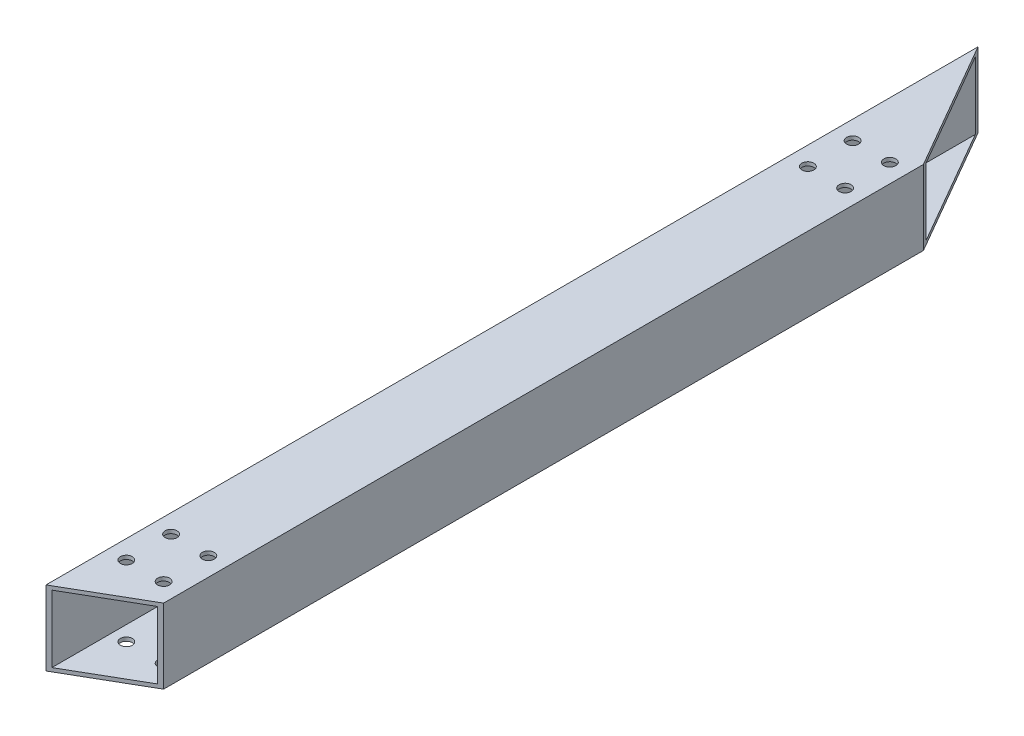
ISO-10303-21;
HEADER;
FILE_DESCRIPTION(('STEP AP214'),'2;1');
FILE_NAME('part.step','',(''),(''),'','','');
FILE_SCHEMA(('AUTOMOTIVE_DESIGN { 1 0 10303 214 1 1 1 1 }'));
ENDSEC;
DATA;
#1=APPLICATION_CONTEXT('core data for automotive mechanical design processes');
#2=APPLICATION_PROTOCOL_DEFINITION('international standard','automotive_design',2000,#1);
#3=PRODUCT_CONTEXT('',#1,'mechanical');
#4=PRODUCT('Part','Part','',(#3));
#5=PRODUCT_RELATED_PRODUCT_CATEGORY('part','',(#4));
#6=PRODUCT_DEFINITION_FORMATION('','',#4);
#7=PRODUCT_DEFINITION_CONTEXT('part definition',#1,'design');
#8=PRODUCT_DEFINITION('design','',#6,#7);
#9=PRODUCT_DEFINITION_SHAPE('','',#8);
#10=(LENGTH_UNIT() NAMED_UNIT(*) SI_UNIT(.MILLI.,.METRE.));
#11=(NAMED_UNIT(*) PLANE_ANGLE_UNIT() SI_UNIT($,.RADIAN.));
#12=(NAMED_UNIT(*) SI_UNIT($,.STERADIAN.) SOLID_ANGLE_UNIT());
#13=UNCERTAINTY_MEASURE_WITH_UNIT(LENGTH_MEASURE(1.E-05),#10,'distance_accuracy_value','');
#14=(GEOMETRIC_REPRESENTATION_CONTEXT(3) GLOBAL_UNCERTAINTY_ASSIGNED_CONTEXT((#13)) GLOBAL_UNIT_ASSIGNED_CONTEXT((#10,
#11,#12)) REPRESENTATION_CONTEXT('',''));
#15=CARTESIAN_POINT('',(0.,0.,0.));
#16=DIRECTION('',(0.,0.,1.));
#17=DIRECTION('',(1.,0.,0.));
#18=AXIS2_PLACEMENT_3D('',#15,#16,#17);
#19=CARTESIAN_POINT('',(1.,19.,250.));
#20=DIRECTION('',(0.,-1.,0.));
#21=DIRECTION('',(0.,0.,-1.));
#22=AXIS2_PLACEMENT_3D('',#19,#20,#21);
#23=PLANE('',#22);
#24=CARTESIAN_POINT('',(15.0000000000003,19.,38.6410161513949));
#25=DIRECTION('',(0.,-1.,0.));
#26=DIRECTION('',(0.,0.,-1.));
#27=AXIS2_PLACEMENT_3D('',#24,#25,#26);
#28=CIRCLE('',#27,1.6);
#29=CARTESIAN_POINT('',(15.0000000000003,19.,37.0410161513949));
#30=VERTEX_POINT('',#29);
#31=EDGE_CURVE('E352',#30,#30,#28,.T.);
#32=ORIENTED_EDGE('',*,*,#31,.F.);
#33=EDGE_LOOP('',(#32));
#34=FACE_BOUND('',#33,.T.);
#35=CARTESIAN_POINT('',(5.00000000004269,19.,221.452994616241));
#36=DIRECTION('',(0.,-1.,0.));
#37=DIRECTION('',(0.,0.,-1.));
#38=AXIS2_PLACEMENT_3D('',#35,#36,#37);
#39=CIRCLE('',#38,1.6);
#40=CARTESIAN_POINT('',(5.00000000004269,19.,219.852994616241));
#41=VERTEX_POINT('',#40);
#42=EDGE_CURVE('E346',#41,#41,#39,.T.);
#43=ORIENTED_EDGE('',*,*,#42,.F.);
#44=EDGE_LOOP('',(#43));
#45=FACE_BOUND('',#44,.T.);
#46=CARTESIAN_POINT('',(15.0000000000427,19.,221.452994616241));
#47=DIRECTION('',(0.,-1.,0.));
#48=DIRECTION('',(0.,0.,-1.));
#49=AXIS2_PLACEMENT_3D('',#46,#47,#48);
#50=CIRCLE('',#49,1.59999999999998);
#51=CARTESIAN_POINT('',(15.0000000000427,19.,219.852994616241));
#52=VERTEX_POINT('',#51);
#53=EDGE_CURVE('E340',#52,#52,#50,.T.);
#54=ORIENTED_EDGE('',*,*,#53,.F.);
#55=EDGE_LOOP('',(#54));
#56=FACE_BOUND('',#55,.T.);
#57=CARTESIAN_POINT('',(15.0000000000429,19.,233.452994616241));
#58=DIRECTION('',(0.,-1.,0.));
#59=DIRECTION('',(0.,0.,-1.));
#60=AXIS2_PLACEMENT_3D('',#57,#58,#59);
#61=CIRCLE('',#60,1.59999999999999);
#62=CARTESIAN_POINT('',(15.0000000000429,19.,231.852994616241));
#63=VERTEX_POINT('',#62);
#64=EDGE_CURVE('E334',#63,#63,#61,.T.);
#65=ORIENTED_EDGE('',*,*,#64,.F.);
#66=EDGE_LOOP('',(#65));
#67=FACE_BOUND('',#66,.T.);
#68=CARTESIAN_POINT('',(5.00000000000034,19.,50.6410161513949));
#69=DIRECTION('',(0.,-1.,0.));
#70=DIRECTION('',(0.,0.,-1.));
#71=AXIS2_PLACEMENT_3D('',#68,#69,#70);
#72=CIRCLE('',#71,1.6);
#73=CARTESIAN_POINT('',(5.00000000000034,19.,49.0410161513949));
#74=VERTEX_POINT('',#73);
#75=EDGE_CURVE('E258',#74,#74,#72,.T.);
#76=ORIENTED_EDGE('',*,*,#75,.F.);
#77=EDGE_LOOP('',(#76));
#78=FACE_BOUND('',#77,.T.);
#79=CARTESIAN_POINT('',(15.0000000000003,19.,50.6410161513949));
#80=DIRECTION('',(0.,-1.,0.));
#81=DIRECTION('',(0.,0.,-1.));
#82=AXIS2_PLACEMENT_3D('',#79,#80,#81);
#83=CIRCLE('',#82,1.6);
#84=CARTESIAN_POINT('',(15.0000000000003,19.,49.0410161513949));
#85=VERTEX_POINT('',#84);
#86=EDGE_CURVE('E325',#85,#85,#83,.T.);
#87=ORIENTED_EDGE('',*,*,#86,.F.);
#88=EDGE_LOOP('',(#87));
#89=FACE_BOUND('',#88,.T.);
#90=CARTESIAN_POINT('',(5.00000000000031,19.,38.6410161513949));
#91=DIRECTION('',(0.,-1.,0.));
#92=DIRECTION('',(0.,0.,-1.));
#93=AXIS2_PLACEMENT_3D('',#90,#91,#92);
#94=CIRCLE('',#93,1.6);
#95=CARTESIAN_POINT('',(5.00000000000031,19.,37.0410161513949));
#96=VERTEX_POINT('',#95);
#97=EDGE_CURVE('E319',#96,#96,#94,.T.);
#98=ORIENTED_EDGE('',*,*,#97,.F.);
#99=EDGE_LOOP('',(#98));
#100=FACE_BOUND('',#99,.T.);
#101=CARTESIAN_POINT('',(5.00000000004288,19.,233.452994616241));
#102=DIRECTION('',(0.,-1.,0.));
#103=DIRECTION('',(0.,0.,-1.));
#104=AXIS2_PLACEMENT_3D('',#101,#102,#103);
#105=CIRCLE('',#104,1.6);
#106=CARTESIAN_POINT('',(5.00000000004288,19.,231.852994616241));
#107=VERTEX_POINT('',#106);
#108=EDGE_CURVE('E313',#107,#107,#105,.T.);
#109=ORIENTED_EDGE('',*,*,#108,.F.);
#110=EDGE_LOOP('',(#109));
#111=FACE_BOUND('',#110,.T.);
#112=DIRECTION('',(-0.500000000000004,0.,-0.866025403784436));
#113=VECTOR('',#112,1.);
#114=CARTESIAN_POINT('',(108.503175473055,19.,187.933012701891));
#115=LINE('',#114,#113);
#116=CARTESIAN_POINT('',(19.,19.,32.9089653438084));
#117=VERTEX_POINT('',#116);
#118=CARTESIAN_POINT('',(1.,19.,1.73205080756889));
#119=VERTEX_POINT('',#118);
#120=EDGE_CURVE('E11',#117,#119,#115,.T.);
#121=ORIENTED_EDGE('',*,*,#120,.F.);
#122=DIRECTION('',(0.,0.,-1.));
#123=VECTOR('',#122,1.);
#124=CARTESIAN_POINT('',(19.,19.,250.));
#125=LINE('',#124,#123);
#126=CARTESIAN_POINT('',(19.,19.,239.030344885397));
#127=VERTEX_POINT('',#126);
#128=EDGE_CURVE('E142',#127,#117,#125,.T.);
#129=ORIENTED_EDGE('',*,*,#128,.F.);
#130=DIRECTION('',(0.866025403784436,0.,-0.500000000000005));
#131=VECTOR('',#130,1.);
#132=CARTESIAN_POINT('',(0.749999999999995,19.,249.566987298108));
#133=LINE('',#132,#131);
#134=CARTESIAN_POINT('',(0.999999999999997,19.,249.42264973081));
#135=VERTEX_POINT('',#134);
#136=EDGE_CURVE('E43',#135,#127,#133,.T.);
#137=ORIENTED_EDGE('',*,*,#136,.F.);
#138=DIRECTION('',(0.,0.,-1.));
#139=VECTOR('',#138,1.);
#140=CARTESIAN_POINT('',(1.,19.,250.));
#141=LINE('',#140,#139);
#142=EDGE_CURVE('E148',#135,#119,#141,.T.);
#143=ORIENTED_EDGE('',*,*,#142,.T.);
#144=EDGE_LOOP('',(#121,#129,#137,#143));
#145=FACE_BOUND('',#144,.T.);
#146=ADVANCED_FACE('F35',(#34,#45,#56,#67,#78,#89,#100,#111,#145),#23,.T.);
#147=CARTESIAN_POINT('',(19.,1.,250.));
#148=DIRECTION('',(-1.,0.,0.));
#149=DIRECTION('',(0.,0.,1.));
#150=AXIS2_PLACEMENT_3D('',#147,#148,#149);
#151=PLANE('',#150);
#152=DIRECTION('',(0.,1.,0.));
#153=VECTOR('',#152,1.);
#154=CARTESIAN_POINT('',(19.,1.,32.9089653438083));
#155=LINE('',#154,#153);
#156=CARTESIAN_POINT('',(19.,1.,32.9089653438083));
#157=VERTEX_POINT('',#156);
#158=EDGE_CURVE('E165',#157,#117,#155,.T.);
#159=ORIENTED_EDGE('',*,*,#158,.F.);
#160=DIRECTION('',(0.,0.,-1.));
#161=VECTOR('',#160,1.);
#162=CARTESIAN_POINT('',(19.,1.,250.));
#163=LINE('',#162,#161);
#164=CARTESIAN_POINT('',(19.,1.,239.030344885397));
#165=VERTEX_POINT('',#164);
#166=EDGE_CURVE('E144',#165,#157,#163,.T.);
#167=ORIENTED_EDGE('',*,*,#166,.F.);
#168=DIRECTION('',(0.,-1.,0.));
#169=VECTOR('',#168,1.);
#170=CARTESIAN_POINT('',(19.,1.,239.030344885397));
#171=LINE('',#170,#169);
#172=EDGE_CURVE('E117',#127,#165,#171,.T.);
#173=ORIENTED_EDGE('',*,*,#172,.F.);
#174=ORIENTED_EDGE('',*,*,#128,.T.);
#175=EDGE_LOOP('',(#159,#167,#173,#174));
#176=FACE_BOUND('',#175,.T.);
#177=ADVANCED_FACE('F141',(#176),#151,.T.);
#178=CARTESIAN_POINT('',(1.,1.,250.));
#179=DIRECTION('',(0.,1.,0.));
#180=DIRECTION('',(0.,0.,1.));
#181=AXIS2_PLACEMENT_3D('',#178,#179,#180);
#182=PLANE('',#181);
#183=CARTESIAN_POINT('',(15.0000000000003,1.,38.6410161513949));
#184=DIRECTION('',(0.,1.,0.));
#185=DIRECTION('',(0.,0.,1.));
#186=AXIS2_PLACEMENT_3D('',#183,#184,#185);
#187=CIRCLE('',#186,1.6);
#188=CARTESIAN_POINT('',(15.0000000000003,1.,40.2410161513949));
#189=VERTEX_POINT('',#188);
#190=EDGE_CURVE('E349',#189,#189,#187,.T.);
#191=ORIENTED_EDGE('',*,*,#190,.F.);
#192=EDGE_LOOP('',(#191));
#193=FACE_BOUND('',#192,.T.);
#194=CARTESIAN_POINT('',(5.00000000004269,1.,221.452994616241));
#195=DIRECTION('',(0.,1.,0.));
#196=DIRECTION('',(0.,0.,1.));
#197=AXIS2_PLACEMENT_3D('',#194,#195,#196);
#198=CIRCLE('',#197,1.6);
#199=CARTESIAN_POINT('',(5.00000000004269,1.,223.052994616241));
#200=VERTEX_POINT('',#199);
#201=EDGE_CURVE('E343',#200,#200,#198,.T.);
#202=ORIENTED_EDGE('',*,*,#201,.F.);
#203=EDGE_LOOP('',(#202));
#204=FACE_BOUND('',#203,.T.);
#205=CARTESIAN_POINT('',(15.0000000000427,1.,221.452994616241));
#206=DIRECTION('',(0.,1.,0.));
#207=DIRECTION('',(0.,0.,1.));
#208=AXIS2_PLACEMENT_3D('',#205,#206,#207);
#209=CIRCLE('',#208,1.59999999999998);
#210=CARTESIAN_POINT('',(15.0000000000427,1.,223.052994616241));
#211=VERTEX_POINT('',#210);
#212=EDGE_CURVE('E337',#211,#211,#209,.T.);
#213=ORIENTED_EDGE('',*,*,#212,.F.);
#214=EDGE_LOOP('',(#213));
#215=FACE_BOUND('',#214,.T.);
#216=CARTESIAN_POINT('',(15.0000000000429,1.,233.452994616241));
#217=DIRECTION('',(0.,1.,0.));
#218=DIRECTION('',(0.,0.,1.));
#219=AXIS2_PLACEMENT_3D('',#216,#217,#218);
#220=CIRCLE('',#219,1.59999999999999);
#221=CARTESIAN_POINT('',(15.0000000000429,1.,235.052994616241));
#222=VERTEX_POINT('',#221);
#223=EDGE_CURVE('E331',#222,#222,#220,.T.);
#224=ORIENTED_EDGE('',*,*,#223,.F.);
#225=EDGE_LOOP('',(#224));
#226=FACE_BOUND('',#225,.T.);
#227=CARTESIAN_POINT('',(5.00000000000034,1.,50.6410161513949));
#228=DIRECTION('',(0.,1.,0.));
#229=DIRECTION('',(0.,0.,1.));
#230=AXIS2_PLACEMENT_3D('',#227,#228,#229);
#231=CIRCLE('',#230,1.6);
#232=CARTESIAN_POINT('',(5.00000000000034,1.,52.2410161513949));
#233=VERTEX_POINT('',#232);
#234=EDGE_CURVE('E328',#233,#233,#231,.T.);
#235=ORIENTED_EDGE('',*,*,#234,.F.);
#236=EDGE_LOOP('',(#235));
#237=FACE_BOUND('',#236,.T.);
#238=CARTESIAN_POINT('',(15.0000000000003,1.,50.6410161513949));
#239=DIRECTION('',(0.,1.,0.));
#240=DIRECTION('',(0.,0.,1.));
#241=AXIS2_PLACEMENT_3D('',#238,#239,#240);
#242=CIRCLE('',#241,1.6);
#243=CARTESIAN_POINT('',(15.0000000000003,1.,52.2410161513949));
#244=VERTEX_POINT('',#243);
#245=EDGE_CURVE('E322',#244,#244,#242,.T.);
#246=ORIENTED_EDGE('',*,*,#245,.F.);
#247=EDGE_LOOP('',(#246));
#248=FACE_BOUND('',#247,.T.);
#249=CARTESIAN_POINT('',(5.00000000000031,1.,38.6410161513949));
#250=DIRECTION('',(0.,1.,0.));
#251=DIRECTION('',(0.,0.,1.));
#252=AXIS2_PLACEMENT_3D('',#249,#250,#251);
#253=CIRCLE('',#252,1.6);
#254=CARTESIAN_POINT('',(5.00000000000031,1.,40.2410161513949));
#255=VERTEX_POINT('',#254);
#256=EDGE_CURVE('E316',#255,#255,#253,.T.);
#257=ORIENTED_EDGE('',*,*,#256,.F.);
#258=EDGE_LOOP('',(#257));
#259=FACE_BOUND('',#258,.T.);
#260=CARTESIAN_POINT('',(5.00000000004288,1.,233.452994616241));
#261=DIRECTION('',(0.,1.,0.));
#262=DIRECTION('',(0.,0.,1.));
#263=AXIS2_PLACEMENT_3D('',#260,#261,#262);
#264=CIRCLE('',#263,1.6);
#265=CARTESIAN_POINT('',(5.00000000004288,1.,235.052994616241));
#266=VERTEX_POINT('',#265);
#267=EDGE_CURVE('E308',#266,#266,#264,.T.);
#268=ORIENTED_EDGE('',*,*,#267,.F.);
#269=EDGE_LOOP('',(#268));
#270=FACE_BOUND('',#269,.T.);
#271=DIRECTION('',(0.500000000000004,0.,0.866025403784436));
#272=VECTOR('',#271,1.);
#273=CARTESIAN_POINT('',(108.503175473055,1.,187.933012701891));
#274=LINE('',#273,#272);
#275=CARTESIAN_POINT('',(1.,1.,1.73205080756889));
#276=VERTEX_POINT('',#275);
#277=EDGE_CURVE('E167',#276,#157,#274,.T.);
#278=ORIENTED_EDGE('',*,*,#277,.F.);
#279=DIRECTION('',(0.,0.,-1.));
#280=VECTOR('',#279,1.);
#281=CARTESIAN_POINT('',(1.,1.,250.));
#282=LINE('',#281,#280);
#283=CARTESIAN_POINT('',(1.,1.,249.42264973081));
#284=VERTEX_POINT('',#283);
#285=EDGE_CURVE('E150',#284,#276,#282,.T.);
#286=ORIENTED_EDGE('',*,*,#285,.F.);
#287=DIRECTION('',(-0.866025403784436,0.,0.500000000000005));
#288=VECTOR('',#287,1.);
#289=CARTESIAN_POINT('',(0.749999999999995,1.,249.566987298108));
#290=LINE('',#289,#288);
#291=EDGE_CURVE('E145',#165,#284,#290,.T.);
#292=ORIENTED_EDGE('',*,*,#291,.F.);
#293=ORIENTED_EDGE('',*,*,#166,.T.);
#294=EDGE_LOOP('',(#278,#286,#292,#293));
#295=FACE_BOUND('',#294,.T.);
#296=ADVANCED_FACE('F180',(#193,#204,#215,#226,#237,#248,#259,#270,#295),#182,.T.);
#297=CARTESIAN_POINT('',(1.,1.,250.));
#298=DIRECTION('',(1.,0.,0.));
#299=DIRECTION('',(0.,0.,-1.));
#300=AXIS2_PLACEMENT_3D('',#297,#298,#299);
#301=PLANE('',#300);
#302=DIRECTION('',(0.,-1.,0.));
#303=VECTOR('',#302,1.);
#304=CARTESIAN_POINT('',(1.,1.,1.73205080756886));
#305=LINE('',#304,#303);
#306=EDGE_CURVE('E173',#119,#276,#305,.T.);
#307=ORIENTED_EDGE('',*,*,#306,.F.);
#308=ORIENTED_EDGE('',*,*,#142,.F.);
#309=DIRECTION('',(0.,1.,0.));
#310=VECTOR('',#309,1.);
#311=CARTESIAN_POINT('',(1.,1.,249.42264973081));
#312=LINE('',#311,#310);
#313=EDGE_CURVE('E58',#284,#135,#312,.T.);
#314=ORIENTED_EDGE('',*,*,#313,.F.);
#315=ORIENTED_EDGE('',*,*,#285,.T.);
#316=EDGE_LOOP('',(#307,#308,#314,#315));
#317=FACE_BOUND('',#316,.T.);
#318=ADVANCED_FACE('F181',(#317),#301,.T.);
#319=CARTESIAN_POINT('',(0.,-100.,250.));
#320=DIRECTION('',(-0.500000000000005,0.,-0.866025403784436));
#321=DIRECTION('',(-0.866025403784436,0.,0.500000000000005));
#322=AXIS2_PLACEMENT_3D('',#319,#320,#321);
#323=PLANE('',#322);
#324=ORIENTED_EDGE('',*,*,#313,.T.);
#325=ORIENTED_EDGE('',*,*,#136,.T.);
#326=ORIENTED_EDGE('',*,*,#172,.T.);
#327=ORIENTED_EDGE('',*,*,#291,.T.);
#328=EDGE_LOOP('',(#324,#325,#326,#327));
#329=FACE_BOUND('',#328,.T.);
#330=DIRECTION('',(0.,1.,0.));
#331=VECTOR('',#330,1.);
#332=CARTESIAN_POINT('',(20.,-100.,238.452994616207));
#333=LINE('',#332,#331);
#334=CARTESIAN_POINT('',(20.,0.,238.452994616207));
#335=VERTEX_POINT('',#334);
#336=CARTESIAN_POINT('',(20.,20.,238.452994616207));
#337=VERTEX_POINT('',#336);
#338=EDGE_CURVE('E50',#335,#337,#333,.T.);
#339=ORIENTED_EDGE('',*,*,#338,.T.);
#340=DIRECTION('',(-0.866025403784436,0.,0.500000000000005));
#341=VECTOR('',#340,1.);
#342=CARTESIAN_POINT('',(0.,20.,250.));
#343=LINE('',#342,#341);
#344=CARTESIAN_POINT('',(0.,20.,250.));
#345=VERTEX_POINT('',#344);
#346=EDGE_CURVE('E120',#337,#345,#343,.T.);
#347=ORIENTED_EDGE('',*,*,#346,.T.);
#348=DIRECTION('',(0.,-1.,0.));
#349=VECTOR('',#348,1.);
#350=CARTESIAN_POINT('',(0.,0.,250.));
#351=LINE('',#350,#349);
#352=CARTESIAN_POINT('',(0.,0.,250.));
#353=VERTEX_POINT('',#352);
#354=EDGE_CURVE('E125',#345,#353,#351,.T.);
#355=ORIENTED_EDGE('',*,*,#354,.T.);
#356=DIRECTION('',(-0.866025403784436,0.,0.500000000000005));
#357=VECTOR('',#356,1.);
#358=CARTESIAN_POINT('',(0.,0.,250.));
#359=LINE('',#358,#357);
#360=EDGE_CURVE('E162',#335,#353,#359,.T.);
#361=ORIENTED_EDGE('',*,*,#360,.F.);
#362=EDGE_LOOP('',(#339,#347,#355,#361));
#363=FACE_BOUND('',#362,.T.);
#364=ADVANCED_FACE('F131',(#329,#363),#323,.F.);
#365=CARTESIAN_POINT('',(20.,-100.,34.6410161513772));
#366=DIRECTION('',(-0.866025403784436,0.,0.500000000000004));
#367=DIRECTION('',(0.500000000000004,0.,0.866025403784436));
#368=AXIS2_PLACEMENT_3D('',#365,#366,#367);
#369=PLANE('',#368);
#370=ORIENTED_EDGE('',*,*,#306,.T.);
#371=ORIENTED_EDGE('',*,*,#277,.T.);
#372=ORIENTED_EDGE('',*,*,#158,.T.);
#373=ORIENTED_EDGE('',*,*,#120,.T.);
#374=EDGE_LOOP('',(#370,#371,#372,#373));
#375=FACE_BOUND('',#374,.T.);
#376=DIRECTION('',(0.,-1.,0.));
#377=VECTOR('',#376,1.);
#378=CARTESIAN_POINT('',(0.,0.,0.));
#379=LINE('',#378,#377);
#380=CARTESIAN_POINT('',(0.,20.,0.));
#381=VERTEX_POINT('',#380);
#382=CARTESIAN_POINT('',(0.,0.,0.));
#383=VERTEX_POINT('',#382);
#384=EDGE_CURVE('E104',#381,#383,#379,.T.);
#385=ORIENTED_EDGE('',*,*,#384,.F.);
#386=DIRECTION('',(0.500000000000004,0.,0.866025403784436));
#387=VECTOR('',#386,1.);
#388=CARTESIAN_POINT('',(20.,20.,34.6410161513772));
#389=LINE('',#388,#387);
#390=CARTESIAN_POINT('',(20.,20.,34.6410161513772));
#391=VERTEX_POINT('',#390);
#392=EDGE_CURVE('E98',#381,#391,#389,.T.);
#393=ORIENTED_EDGE('',*,*,#392,.T.);
#394=DIRECTION('',(0.,1.,0.));
#395=VECTOR('',#394,1.);
#396=CARTESIAN_POINT('',(20.,-100.,34.6410161513772));
#397=LINE('',#396,#395);
#398=CARTESIAN_POINT('',(20.,0.,34.6410161513772));
#399=VERTEX_POINT('',#398);
#400=EDGE_CURVE('E101',#399,#391,#397,.T.);
#401=ORIENTED_EDGE('',*,*,#400,.F.);
#402=DIRECTION('',(0.500000000000004,0.,0.866025403784436));
#403=VECTOR('',#402,1.);
#404=CARTESIAN_POINT('',(108.253175473055,0.,187.499999999999));
#405=LINE('',#404,#403);
#406=EDGE_CURVE('E152',#383,#399,#405,.T.);
#407=ORIENTED_EDGE('',*,*,#406,.F.);
#408=EDGE_LOOP('',(#385,#393,#401,#407));
#409=FACE_BOUND('',#408,.T.);
#410=ADVANCED_FACE('F100',(#375,#409),#369,.F.);
#411=CARTESIAN_POINT('',(0.,0.,250.));
#412=DIRECTION('',(1.,0.,0.));
#413=DIRECTION('',(0.,0.,-1.));
#414=AXIS2_PLACEMENT_3D('',#411,#412,#413);
#415=PLANE('',#414);
#416=ORIENTED_EDGE('',*,*,#384,.T.);
#417=DIRECTION('',(0.,0.,-1.));
#418=VECTOR('',#417,1.);
#419=CARTESIAN_POINT('',(0.,0.,250.));
#420=LINE('',#419,#418);
#421=EDGE_CURVE('E123',#353,#383,#420,.T.);
#422=ORIENTED_EDGE('',*,*,#421,.F.);
#423=ORIENTED_EDGE('',*,*,#354,.F.);
#424=DIRECTION('',(0.,0.,-1.));
#425=VECTOR('',#424,1.);
#426=CARTESIAN_POINT('',(0.,20.,250.));
#427=LINE('',#426,#425);
#428=EDGE_CURVE('E121',#345,#381,#427,.T.);
#429=ORIENTED_EDGE('',*,*,#428,.T.);
#430=EDGE_LOOP('',(#416,#422,#423,#429));
#431=FACE_BOUND('',#430,.T.);
#432=ADVANCED_FACE('F37',(#431),#415,.F.);
#433=CARTESIAN_POINT('',(0.,0.,250.));
#434=DIRECTION('',(0.,1.,0.));
#435=DIRECTION('',(0.,0.,1.));
#436=AXIS2_PLACEMENT_3D('',#433,#434,#435);
#437=PLANE('',#436);
#438=CARTESIAN_POINT('',(15.0000000000003,0.,38.6410161513949));
#439=DIRECTION('',(0.,-1.,0.));
#440=DIRECTION('',(0.,0.,-1.));
#441=AXIS2_PLACEMENT_3D('',#438,#439,#440);
#442=CIRCLE('',#441,1.6);
#443=CARTESIAN_POINT('',(15.0000000000003,0.,37.0410161513949));
#444=VERTEX_POINT('',#443);
#445=EDGE_CURVE('E275',#444,#444,#442,.T.);
#446=ORIENTED_EDGE('',*,*,#445,.F.);
#447=EDGE_LOOP('',(#446));
#448=FACE_BOUND('',#447,.T.);
#449=CARTESIAN_POINT('',(5.00000000004269,0.,221.452994616241));
#450=DIRECTION('',(0.,-1.,0.));
#451=DIRECTION('',(0.,0.,-1.));
#452=AXIS2_PLACEMENT_3D('',#449,#450,#451);
#453=CIRCLE('',#452,1.6);
#454=CARTESIAN_POINT('',(5.00000000004269,0.,219.852994616241));
#455=VERTEX_POINT('',#454);
#456=EDGE_CURVE('E285',#455,#455,#453,.T.);
#457=ORIENTED_EDGE('',*,*,#456,.F.);
#458=EDGE_LOOP('',(#457));
#459=FACE_BOUND('',#458,.T.);
#460=CARTESIAN_POINT('',(15.0000000000427,0.,221.452994616241));
#461=DIRECTION('',(0.,-1.,0.));
#462=DIRECTION('',(0.,0.,-1.));
#463=AXIS2_PLACEMENT_3D('',#460,#461,#462);
#464=CIRCLE('',#463,1.59999999999998);
#465=CARTESIAN_POINT('',(15.0000000000427,0.,219.852994616241));
#466=VERTEX_POINT('',#465);
#467=EDGE_CURVE('E284',#466,#466,#464,.T.);
#468=ORIENTED_EDGE('',*,*,#467,.F.);
#469=EDGE_LOOP('',(#468));
#470=FACE_BOUND('',#469,.T.);
#471=CARTESIAN_POINT('',(15.0000000000429,0.,233.452994616241));
#472=DIRECTION('',(0.,-1.,0.));
#473=DIRECTION('',(0.,0.,-1.));
#474=AXIS2_PLACEMENT_3D('',#471,#472,#473);
#475=CIRCLE('',#474,1.59999999999999);
#476=CARTESIAN_POINT('',(15.0000000000429,0.,231.852994616241));
#477=VERTEX_POINT('',#476);
#478=EDGE_CURVE('E297',#477,#477,#475,.T.);
#479=ORIENTED_EDGE('',*,*,#478,.F.);
#480=EDGE_LOOP('',(#479));
#481=FACE_BOUND('',#480,.T.);
#482=CARTESIAN_POINT('',(5.00000000000034,0.,50.6410161513949));
#483=DIRECTION('',(0.,-1.,0.));
#484=DIRECTION('',(0.,0.,-1.));
#485=AXIS2_PLACEMENT_3D('',#482,#483,#484);
#486=CIRCLE('',#485,1.6);
#487=CARTESIAN_POINT('',(5.00000000000034,0.,49.0410161513949));
#488=VERTEX_POINT('',#487);
#489=EDGE_CURVE('E264',#488,#488,#486,.T.);
#490=ORIENTED_EDGE('',*,*,#489,.F.);
#491=EDGE_LOOP('',(#490));
#492=FACE_BOUND('',#491,.T.);
#493=CARTESIAN_POINT('',(15.0000000000003,0.,50.6410161513949));
#494=DIRECTION('',(0.,-1.,0.));
#495=DIRECTION('',(0.,0.,-1.));
#496=AXIS2_PLACEMENT_3D('',#493,#494,#495);
#497=CIRCLE('',#496,1.6);
#498=CARTESIAN_POINT('',(15.0000000000003,0.,49.0410161513949));
#499=VERTEX_POINT('',#498);
#500=EDGE_CURVE('E263',#499,#499,#497,.T.);
#501=ORIENTED_EDGE('',*,*,#500,.F.);
#502=EDGE_LOOP('',(#501));
#503=FACE_BOUND('',#502,.T.);
#504=CARTESIAN_POINT('',(5.00000000000031,0.,38.6410161513949));
#505=DIRECTION('',(0.,-1.,0.));
#506=DIRECTION('',(0.,0.,-1.));
#507=AXIS2_PLACEMENT_3D('',#504,#505,#506);
#508=CIRCLE('',#507,1.6);
#509=CARTESIAN_POINT('',(5.00000000000031,0.,37.0410161513949));
#510=VERTEX_POINT('',#509);
#511=EDGE_CURVE('E276',#510,#510,#508,.T.);
#512=ORIENTED_EDGE('',*,*,#511,.F.);
#513=EDGE_LOOP('',(#512));
#514=FACE_BOUND('',#513,.T.);
#515=CARTESIAN_POINT('',(5.00000000004288,0.,233.452994616241));
#516=DIRECTION('',(0.,-1.,0.));
#517=DIRECTION('',(0.,0.,-1.));
#518=AXIS2_PLACEMENT_3D('',#515,#516,#517);
#519=CIRCLE('',#518,1.6);
#520=CARTESIAN_POINT('',(5.00000000004288,0.,231.852994616241));
#521=VERTEX_POINT('',#520);
#522=EDGE_CURVE('E296',#521,#521,#519,.T.);
#523=ORIENTED_EDGE('',*,*,#522,.F.);
#524=EDGE_LOOP('',(#523));
#525=FACE_BOUND('',#524,.T.);
#526=ORIENTED_EDGE('',*,*,#421,.T.);
#527=ORIENTED_EDGE('',*,*,#406,.T.);
#528=DIRECTION('',(0.,0.,-1.));
#529=VECTOR('',#528,1.);
#530=CARTESIAN_POINT('',(20.,0.,250.));
#531=LINE('',#530,#529);
#532=EDGE_CURVE('E116',#335,#399,#531,.T.);
#533=ORIENTED_EDGE('',*,*,#532,.F.);
#534=ORIENTED_EDGE('',*,*,#360,.T.);
#535=EDGE_LOOP('',(#526,#527,#533,#534));
#536=FACE_BOUND('',#535,.T.);
#537=ADVANCED_FACE('F164',(#448,#459,#470,#481,#492,#503,#514,#525,#536),#437,.F.);
#538=CARTESIAN_POINT('',(20.,0.,250.));
#539=DIRECTION('',(-1.,0.,0.));
#540=DIRECTION('',(0.,0.,1.));
#541=AXIS2_PLACEMENT_3D('',#538,#539,#540);
#542=PLANE('',#541);
#543=ORIENTED_EDGE('',*,*,#532,.T.);
#544=ORIENTED_EDGE('',*,*,#400,.T.);
#545=DIRECTION('',(0.,0.,-1.));
#546=VECTOR('',#545,1.);
#547=CARTESIAN_POINT('',(20.,20.,250.));
#548=LINE('',#547,#546);
#549=EDGE_CURVE('E114',#337,#391,#548,.T.);
#550=ORIENTED_EDGE('',*,*,#549,.F.);
#551=ORIENTED_EDGE('',*,*,#338,.F.);
#552=EDGE_LOOP('',(#543,#544,#550,#551));
#553=FACE_BOUND('',#552,.T.);
#554=ADVANCED_FACE('F113',(#553),#542,.F.);
#555=CARTESIAN_POINT('',(0.,20.,250.));
#556=DIRECTION('',(0.,-1.,0.));
#557=DIRECTION('',(0.,0.,-1.));
#558=AXIS2_PLACEMENT_3D('',#555,#556,#557);
#559=PLANE('',#558);
#560=CARTESIAN_POINT('',(15.0000000000003,20.,38.6410161513949));
#561=DIRECTION('',(0.,-1.,0.));
#562=DIRECTION('',(0.,0.,-1.));
#563=AXIS2_PLACEMENT_3D('',#560,#561,#562);
#564=CIRCLE('',#563,1.6);
#565=CARTESIAN_POINT('',(15.0000000000003,20.,37.0410161513949));
#566=VERTEX_POINT('',#565);
#567=EDGE_CURVE('E288',#566,#566,#564,.T.);
#568=ORIENTED_EDGE('',*,*,#567,.T.);
#569=EDGE_LOOP('',(#568));
#570=FACE_BOUND('',#569,.T.);
#571=CARTESIAN_POINT('',(5.00000000004269,20.,221.452994616241));
#572=DIRECTION('',(0.,-1.,0.));
#573=DIRECTION('',(0.,0.,-1.));
#574=AXIS2_PLACEMENT_3D('',#571,#572,#573);
#575=CIRCLE('',#574,1.6);
#576=CARTESIAN_POINT('',(5.00000000004269,20.,219.852994616241));
#577=VERTEX_POINT('',#576);
#578=EDGE_CURVE('E281',#577,#577,#575,.T.);
#579=ORIENTED_EDGE('',*,*,#578,.T.);
#580=EDGE_LOOP('',(#579));
#581=FACE_BOUND('',#580,.T.);
#582=CARTESIAN_POINT('',(15.0000000000427,20.,221.452994616241));
#583=DIRECTION('',(0.,-1.,0.));
#584=DIRECTION('',(0.,0.,-1.));
#585=AXIS2_PLACEMENT_3D('',#582,#583,#584);
#586=CIRCLE('',#585,1.59999999999998);
#587=CARTESIAN_POINT('',(15.0000000000427,20.,219.852994616241));
#588=VERTEX_POINT('',#587);
#589=EDGE_CURVE('E300',#588,#588,#586,.T.);
#590=ORIENTED_EDGE('',*,*,#589,.T.);
#591=EDGE_LOOP('',(#590));
#592=FACE_BOUND('',#591,.T.);
#593=CARTESIAN_POINT('',(15.0000000000429,20.,233.452994616241));
#594=DIRECTION('',(0.,-1.,0.));
#595=DIRECTION('',(0.,0.,-1.));
#596=AXIS2_PLACEMENT_3D('',#593,#594,#595);
#597=CIRCLE('',#596,1.59999999999999);
#598=CARTESIAN_POINT('',(15.0000000000429,20.,231.852994616241));
#599=VERTEX_POINT('',#598);
#600=EDGE_CURVE('E293',#599,#599,#597,.T.);
#601=ORIENTED_EDGE('',*,*,#600,.T.);
#602=EDGE_LOOP('',(#601));
#603=FACE_BOUND('',#602,.T.);
#604=CARTESIAN_POINT('',(5.00000000000034,20.,50.6410161513949));
#605=DIRECTION('',(0.,-1.,0.));
#606=DIRECTION('',(0.,0.,-1.));
#607=AXIS2_PLACEMENT_3D('',#604,#605,#606);
#608=CIRCLE('',#607,1.6);
#609=CARTESIAN_POINT('',(5.00000000000034,20.,49.0410161513949));
#610=VERTEX_POINT('',#609);
#611=EDGE_CURVE('E261',#610,#610,#608,.T.);
#612=ORIENTED_EDGE('',*,*,#611,.T.);
#613=EDGE_LOOP('',(#612));
#614=FACE_BOUND('',#613,.T.);
#615=CARTESIAN_POINT('',(15.0000000000003,20.,50.6410161513949));
#616=DIRECTION('',(0.,-1.,0.));
#617=DIRECTION('',(0.,0.,-1.));
#618=AXIS2_PLACEMENT_3D('',#615,#616,#617);
#619=CIRCLE('',#618,1.6);
#620=CARTESIAN_POINT('',(15.0000000000003,20.,49.0410161513949));
#621=VERTEX_POINT('',#620);
#622=EDGE_CURVE('E267',#621,#621,#619,.T.);
#623=ORIENTED_EDGE('',*,*,#622,.T.);
#624=EDGE_LOOP('',(#623));
#625=FACE_BOUND('',#624,.T.);
#626=CARTESIAN_POINT('',(5.00000000000031,20.,38.6410161513949));
#627=DIRECTION('',(0.,-1.,0.));
#628=DIRECTION('',(0.,0.,-1.));
#629=AXIS2_PLACEMENT_3D('',#626,#627,#628);
#630=CIRCLE('',#629,1.6);
#631=CARTESIAN_POINT('',(5.00000000000031,20.,37.0410161513949));
#632=VERTEX_POINT('',#631);
#633=EDGE_CURVE('E272',#632,#632,#630,.T.);
#634=ORIENTED_EDGE('',*,*,#633,.T.);
#635=EDGE_LOOP('',(#634));
#636=FACE_BOUND('',#635,.T.);
#637=CARTESIAN_POINT('',(5.00000000004288,20.,233.452994616241));
#638=DIRECTION('',(0.,-1.,0.));
#639=DIRECTION('',(0.,0.,-1.));
#640=AXIS2_PLACEMENT_3D('',#637,#638,#639);
#641=CIRCLE('',#640,1.6);
#642=CARTESIAN_POINT('',(5.00000000004288,20.,231.852994616241));
#643=VERTEX_POINT('',#642);
#644=EDGE_CURVE('E305',#643,#643,#641,.T.);
#645=ORIENTED_EDGE('',*,*,#644,.T.);
#646=EDGE_LOOP('',(#645));
#647=FACE_BOUND('',#646,.T.);
#648=ORIENTED_EDGE('',*,*,#549,.T.);
#649=ORIENTED_EDGE('',*,*,#392,.F.);
#650=ORIENTED_EDGE('',*,*,#428,.F.);
#651=ORIENTED_EDGE('',*,*,#346,.F.);
#652=EDGE_LOOP('',(#648,#649,#650,#651));
#653=FACE_BOUND('',#652,.T.);
#654=ADVANCED_FACE('F119',(#570,#581,#592,#603,#614,#625,#636,#647,#653),#559,.F.);
#655=CARTESIAN_POINT('',(5.00000000004288,20.,233.452994616241));
#656=DIRECTION('',(0.,-1.,0.));
#657=DIRECTION('',(0.,0.,-1.));
#658=AXIS2_PLACEMENT_3D('',#655,#656,#657);
#659=CYLINDRICAL_SURFACE('',#658,1.6);
#660=ORIENTED_EDGE('',*,*,#108,.T.);
#661=EDGE_LOOP('',(#660));
#662=FACE_BOUND('',#661,.T.);
#663=ORIENTED_EDGE('',*,*,#644,.F.);
#664=EDGE_LOOP('',(#663));
#665=FACE_BOUND('',#664,.T.);
#666=ADVANCED_FACE('F210',(#662,#665),#659,.F.);
#667=CARTESIAN_POINT('',(5.00000000000031,20.,38.6410161513949));
#668=DIRECTION('',(0.,-1.,0.));
#669=DIRECTION('',(0.,0.,-1.));
#670=AXIS2_PLACEMENT_3D('',#667,#668,#669);
#671=CYLINDRICAL_SURFACE('',#670,1.6);
#672=ORIENTED_EDGE('',*,*,#97,.T.);
#673=EDGE_LOOP('',(#672));
#674=FACE_BOUND('',#673,.T.);
#675=ORIENTED_EDGE('',*,*,#633,.F.);
#676=EDGE_LOOP('',(#675));
#677=FACE_BOUND('',#676,.T.);
#678=ADVANCED_FACE('F239',(#674,#677),#671,.F.);
#679=CARTESIAN_POINT('',(15.0000000000003,20.,50.6410161513949));
#680=DIRECTION('',(0.,-1.,0.));
#681=DIRECTION('',(0.,0.,-1.));
#682=AXIS2_PLACEMENT_3D('',#679,#680,#681);
#683=CYLINDRICAL_SURFACE('',#682,1.6);
#684=ORIENTED_EDGE('',*,*,#86,.T.);
#685=EDGE_LOOP('',(#684));
#686=FACE_BOUND('',#685,.T.);
#687=ORIENTED_EDGE('',*,*,#622,.F.);
#688=EDGE_LOOP('',(#687));
#689=FACE_BOUND('',#688,.T.);
#690=ADVANCED_FACE('F235',(#686,#689),#683,.F.);
#691=CARTESIAN_POINT('',(5.00000000000034,20.,50.6410161513949));
#692=DIRECTION('',(0.,-1.,0.));
#693=DIRECTION('',(0.,0.,-1.));
#694=AXIS2_PLACEMENT_3D('',#691,#692,#693);
#695=CYLINDRICAL_SURFACE('',#694,1.6);
#696=ORIENTED_EDGE('',*,*,#75,.T.);
#697=EDGE_LOOP('',(#696));
#698=FACE_BOUND('',#697,.T.);
#699=ORIENTED_EDGE('',*,*,#611,.F.);
#700=EDGE_LOOP('',(#699));
#701=FACE_BOUND('',#700,.T.);
#702=ADVANCED_FACE('F242',(#698,#701),#695,.F.);
#703=CARTESIAN_POINT('',(15.0000000000429,20.,233.452994616241));
#704=DIRECTION('',(0.,-1.,0.));
#705=DIRECTION('',(0.,0.,-1.));
#706=AXIS2_PLACEMENT_3D('',#703,#704,#705);
#707=CYLINDRICAL_SURFACE('',#706,1.59999999999999);
#708=ORIENTED_EDGE('',*,*,#64,.T.);
#709=EDGE_LOOP('',(#708));
#710=FACE_BOUND('',#709,.T.);
#711=ORIENTED_EDGE('',*,*,#600,.F.);
#712=EDGE_LOOP('',(#711));
#713=FACE_BOUND('',#712,.T.);
#714=ADVANCED_FACE('F222',(#710,#713),#707,.F.);
#715=CARTESIAN_POINT('',(15.0000000000427,20.,221.452994616241));
#716=DIRECTION('',(0.,-1.,0.));
#717=DIRECTION('',(0.,0.,-1.));
#718=AXIS2_PLACEMENT_3D('',#715,#716,#717);
#719=CYLINDRICAL_SURFACE('',#718,1.59999999999998);
#720=ORIENTED_EDGE('',*,*,#53,.T.);
#721=EDGE_LOOP('',(#720));
#722=FACE_BOUND('',#721,.T.);
#723=ORIENTED_EDGE('',*,*,#589,.F.);
#724=EDGE_LOOP('',(#723));
#725=FACE_BOUND('',#724,.T.);
#726=ADVANCED_FACE('F217',(#722,#725),#719,.F.);
#727=CARTESIAN_POINT('',(5.00000000004269,20.,221.452994616241));
#728=DIRECTION('',(0.,-1.,0.));
#729=DIRECTION('',(0.,0.,-1.));
#730=AXIS2_PLACEMENT_3D('',#727,#728,#729);
#731=CYLINDRICAL_SURFACE('',#730,1.6);
#732=ORIENTED_EDGE('',*,*,#42,.T.);
#733=EDGE_LOOP('',(#732));
#734=FACE_BOUND('',#733,.T.);
#735=ORIENTED_EDGE('',*,*,#578,.F.);
#736=EDGE_LOOP('',(#735));
#737=FACE_BOUND('',#736,.T.);
#738=ADVANCED_FACE('F230',(#734,#737),#731,.F.);
#739=CARTESIAN_POINT('',(15.0000000000003,20.,38.6410161513949));
#740=DIRECTION('',(0.,-1.,0.));
#741=DIRECTION('',(0.,0.,-1.));
#742=AXIS2_PLACEMENT_3D('',#739,#740,#741);
#743=CYLINDRICAL_SURFACE('',#742,1.6);
#744=ORIENTED_EDGE('',*,*,#31,.T.);
#745=EDGE_LOOP('',(#744));
#746=FACE_BOUND('',#745,.T.);
#747=ORIENTED_EDGE('',*,*,#567,.F.);
#748=EDGE_LOOP('',(#747));
#749=FACE_BOUND('',#748,.T.);
#750=ADVANCED_FACE('F208',(#746,#749),#743,.F.);
#751=ORIENTED_EDGE('',*,*,#267,.T.);
#752=EDGE_LOOP('',(#751));
#753=FACE_BOUND('',#752,.T.);
#754=ORIENTED_EDGE('',*,*,#522,.T.);
#755=EDGE_LOOP('',(#754));
#756=FACE_BOUND('',#755,.T.);
#757=ADVANCED_FACE('F204',(#753,#756),#659,.F.);
#758=ORIENTED_EDGE('',*,*,#256,.T.);
#759=EDGE_LOOP('',(#758));
#760=FACE_BOUND('',#759,.T.);
#761=ORIENTED_EDGE('',*,*,#511,.T.);
#762=EDGE_LOOP('',(#761));
#763=FACE_BOUND('',#762,.T.);
#764=ADVANCED_FACE('F207',(#760,#763),#671,.F.);
#765=ORIENTED_EDGE('',*,*,#245,.T.);
#766=EDGE_LOOP('',(#765));
#767=FACE_BOUND('',#766,.T.);
#768=ORIENTED_EDGE('',*,*,#500,.T.);
#769=EDGE_LOOP('',(#768));
#770=FACE_BOUND('',#769,.T.);
#771=ADVANCED_FACE('F231',(#767,#770),#683,.F.);
#772=ORIENTED_EDGE('',*,*,#234,.T.);
#773=EDGE_LOOP('',(#772));
#774=FACE_BOUND('',#773,.T.);
#775=ORIENTED_EDGE('',*,*,#489,.T.);
#776=EDGE_LOOP('',(#775));
#777=FACE_BOUND('',#776,.T.);
#778=ADVANCED_FACE('F220',(#774,#777),#695,.F.);
#779=ORIENTED_EDGE('',*,*,#223,.T.);
#780=EDGE_LOOP('',(#779));
#781=FACE_BOUND('',#780,.T.);
#782=ORIENTED_EDGE('',*,*,#478,.T.);
#783=EDGE_LOOP('',(#782));
#784=FACE_BOUND('',#783,.T.);
#785=ADVANCED_FACE('F215',(#781,#784),#707,.F.);
#786=ORIENTED_EDGE('',*,*,#212,.T.);
#787=EDGE_LOOP('',(#786));
#788=FACE_BOUND('',#787,.T.);
#789=ORIENTED_EDGE('',*,*,#467,.T.);
#790=EDGE_LOOP('',(#789));
#791=FACE_BOUND('',#790,.T.);
#792=ADVANCED_FACE('F211',(#788,#791),#719,.F.);
#793=ORIENTED_EDGE('',*,*,#201,.T.);
#794=EDGE_LOOP('',(#793));
#795=FACE_BOUND('',#794,.T.);
#796=ORIENTED_EDGE('',*,*,#456,.T.);
#797=EDGE_LOOP('',(#796));
#798=FACE_BOUND('',#797,.T.);
#799=ADVANCED_FACE('F214',(#795,#798),#731,.F.);
#800=ORIENTED_EDGE('',*,*,#190,.T.);
#801=EDGE_LOOP('',(#800));
#802=FACE_BOUND('',#801,.T.);
#803=ORIENTED_EDGE('',*,*,#445,.T.);
#804=EDGE_LOOP('',(#803));
#805=FACE_BOUND('',#804,.T.);
#806=ADVANCED_FACE('F223',(#802,#805),#743,.F.);
#807=CLOSED_SHELL('',(#146,#177,#296,#318,#364,#410,#432,#537,#554,#654,#666,#678,#690,#702,
#714,#726,#738,#750,#757,#764,#771,#778,#785,#792,#799,#806));
#808=MANIFOLD_SOLID_BREP('B2',#807);
#809=ADVANCED_BREP_SHAPE_REPRESENTATION('',(#18,#808),#14);
#810=SHAPE_DEFINITION_REPRESENTATION(#9,#809);
ENDSEC;
END-ISO-10303-21;
